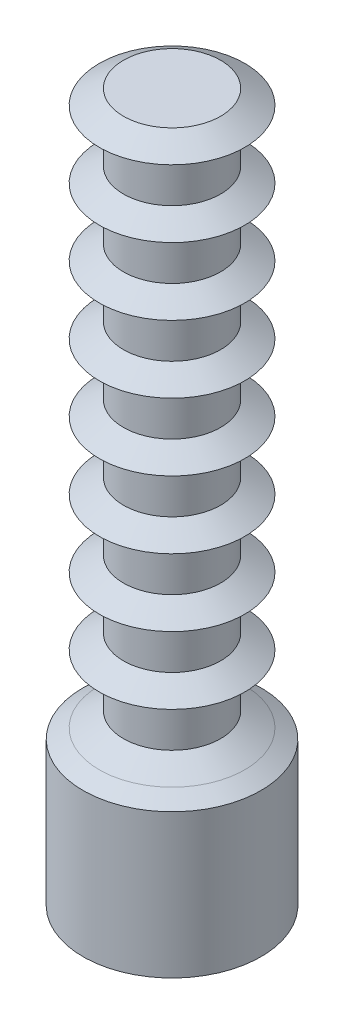
ISO-10303-21;
HEADER;
FILE_DESCRIPTION(('STEP AP214'),'2;1');
FILE_NAME('part.step','',(''),(''),'','','');
FILE_SCHEMA(('AUTOMOTIVE_DESIGN { 1 0 10303 214 1 1 1 1 }'));
ENDSEC;
DATA;
#1=APPLICATION_CONTEXT('core data for automotive mechanical design processes');
#2=APPLICATION_PROTOCOL_DEFINITION('international standard','automotive_design',2000,#1);
#3=PRODUCT_CONTEXT('',#1,'mechanical');
#4=PRODUCT('Part','Part','',(#3));
#5=PRODUCT_RELATED_PRODUCT_CATEGORY('part','',(#4));
#6=PRODUCT_DEFINITION_FORMATION('','',#4);
#7=PRODUCT_DEFINITION_CONTEXT('part definition',#1,'design');
#8=PRODUCT_DEFINITION('design','',#6,#7);
#9=PRODUCT_DEFINITION_SHAPE('','',#8);
#10=(LENGTH_UNIT() NAMED_UNIT(*) SI_UNIT(.MILLI.,.METRE.));
#11=(NAMED_UNIT(*) PLANE_ANGLE_UNIT() SI_UNIT($,.RADIAN.));
#12=(NAMED_UNIT(*) SI_UNIT($,.STERADIAN.) SOLID_ANGLE_UNIT());
#13=UNCERTAINTY_MEASURE_WITH_UNIT(LENGTH_MEASURE(1.E-05),#10,'distance_accuracy_value','');
#14=(GEOMETRIC_REPRESENTATION_CONTEXT(3) GLOBAL_UNCERTAINTY_ASSIGNED_CONTEXT((#13)) GLOBAL_UNIT_ASSIGNED_CONTEXT((#10,
#11,#12)) REPRESENTATION_CONTEXT('',''));
#15=CARTESIAN_POINT('',(0.,0.,0.));
#16=DIRECTION('',(0.,0.,1.));
#17=DIRECTION('',(1.,0.,0.));
#18=AXIS2_PLACEMENT_3D('',#15,#16,#17);
#19=CARTESIAN_POINT('',(-5.43163068128664,7.26000000000113,0.));
#20=DIRECTION('',(0.,-1.,0.));
#21=DIRECTION('',(1.,0.,0.));
#22=AXIS2_PLACEMENT_3D('',#19,#20,#21);
#23=CONICAL_SURFACE('',#22,3.43583917011976,1.02509404757011);
#24=CARTESIAN_POINT('',(-5.43163068128664,6.79599581917504,0.));
#25=DIRECTION('',(0.,1.,0.));
#26=DIRECTION('',(-1.,0.,0.));
#27=AXIS2_PLACEMENT_3D('',#24,#25,#26);
#28=CIRCLE('',#27,4.19999999999962);
#29=CARTESIAN_POINT('',(-9.63163068128626,6.79599581917504,0.));
#30=VERTEX_POINT('',#29);
#31=EDGE_CURVE('E119',#30,#30,#28,.T.);
#32=ORIENTED_EDGE('',*,*,#31,.T.);
#33=EDGE_LOOP('',(#32));
#34=FACE_BOUND('',#33,.T.);
#35=CARTESIAN_POINT('',(-5.43163068128664,7.26000000000113,0.));
#36=DIRECTION('',(0.,1.,0.));
#37=DIRECTION('',(-1.,0.,0.));
#38=AXIS2_PLACEMENT_3D('',#35,#36,#37);
#39=CIRCLE('',#38,3.43583917011976);
#40=CARTESIAN_POINT('',(-8.8674698514064,7.26000000000113,0.));
#41=VERTEX_POINT('',#40);
#42=EDGE_CURVE('E10',#41,#41,#39,.T.);
#43=ORIENTED_EDGE('',*,*,#42,.F.);
#44=EDGE_LOOP('',(#43));
#45=FACE_BOUND('',#44,.T.);
#46=ADVANCED_FACE('F31',(#34,#45),#23,.T.);
#47=CARTESIAN_POINT('',(-5.43163068128664,7.96000000000303,0.));
#48=DIRECTION('',(0.,-1.,0.));
#49=DIRECTION('',(1.,0.,0.));
#50=AXIS2_PLACEMENT_3D('',#47,#48,#49);
#51=CONICAL_SURFACE('',#50,2.29276466619483,1.02132101334252);
#52=ORIENTED_EDGE('',*,*,#42,.T.);
#53=EDGE_LOOP('',(#52));
#54=FACE_BOUND('',#53,.T.);
#55=CARTESIAN_POINT('',(-5.43163068128664,7.96000000000303,0.));
#56=DIRECTION('',(0.,1.,0.));
#57=DIRECTION('',(-1.,0.,0.));
#58=AXIS2_PLACEMENT_3D('',#55,#56,#57);
#59=CIRCLE('',#58,2.29276466619483);
#60=CARTESIAN_POINT('',(-7.72439534748146,7.96000000000303,0.));
#61=VERTEX_POINT('',#60);
#62=EDGE_CURVE('E37',#61,#61,#59,.T.);
#63=ORIENTED_EDGE('',*,*,#62,.F.);
#64=EDGE_LOOP('',(#63));
#65=FACE_BOUND('',#64,.T.);
#66=ADVANCED_FACE('F142',(#54,#65),#51,.T.);
#67=CARTESIAN_POINT('',(-5.43163068128664,34.1999999999976,0.));
#68=DIRECTION('',(0.,1.,0.));
#69=DIRECTION('',(-1.,0.,0.));
#70=AXIS2_PLACEMENT_3D('',#67,#68,#69);
#71=CYLINDRICAL_SURFACE('',#70,2.29276466619476);
#72=CARTESIAN_POINT('',(-5.43163068128664,9.75415529764743,0.));
#73=DIRECTION('',(0.,1.,0.));
#74=DIRECTION('',(-1.,0.,0.));
#75=AXIS2_PLACEMENT_3D('',#72,#73,#74);
#76=CIRCLE('',#75,2.29276466619469);
#77=CARTESIAN_POINT('',(-7.72439534748133,9.75415529764743,0.));
#78=VERTEX_POINT('',#77);
#79=EDGE_CURVE('E41',#78,#78,#76,.T.);
#80=ORIENTED_EDGE('',*,*,#79,.F.);
#81=EDGE_LOOP('',(#80));
#82=FACE_BOUND('',#81,.T.);
#83=ORIENTED_EDGE('',*,*,#62,.T.);
#84=EDGE_LOOP('',(#83));
#85=FACE_BOUND('',#84,.T.);
#86=ADVANCED_FACE('F146',(#82,#85),#71,.T.);
#87=CARTESIAN_POINT('',(-5.43163068128664,9.75415529764743,0.));
#88=DIRECTION('',(0.,1.,0.));
#89=DIRECTION('',(-1.,0.,0.));
#90=AXIS2_PLACEMENT_3D('',#87,#88,#89);
#91=CONICAL_SURFACE('',#90,2.29276466619469,1.03037682652546);
#92=CARTESIAN_POINT('',(-5.43163068128664,10.4400000000007,0.));
#93=DIRECTION('',(0.,1.,0.));
#94=DIRECTION('',(-1.,0.,0.));
#95=AXIS2_PLACEMENT_3D('',#92,#93,#94);
#96=CIRCLE('',#95,3.43583917011973);
#97=CARTESIAN_POINT('',(-8.86746985140636,10.4400000000007,0.));
#98=VERTEX_POINT('',#97);
#99=EDGE_CURVE('E45',#98,#98,#96,.T.);
#100=ORIENTED_EDGE('',*,*,#99,.F.);
#101=EDGE_LOOP('',(#100));
#102=FACE_BOUND('',#101,.T.);
#103=ORIENTED_EDGE('',*,*,#79,.T.);
#104=EDGE_LOOP('',(#103));
#105=FACE_BOUND('',#104,.T.);
#106=ADVANCED_FACE('F150',(#102,#105),#91,.T.);
#107=CARTESIAN_POINT('',(-5.43163068128664,11.1400000000026,0.));
#108=DIRECTION('',(0.,-1.,0.));
#109=DIRECTION('',(1.,0.,0.));
#110=AXIS2_PLACEMENT_3D('',#107,#108,#109);
#111=CONICAL_SURFACE('',#110,2.29276466619479,1.02132101334252);
#112=ORIENTED_EDGE('',*,*,#99,.T.);
#113=EDGE_LOOP('',(#112));
#114=FACE_BOUND('',#113,.T.);
#115=CARTESIAN_POINT('',(-5.43163068128664,11.1400000000026,0.));
#116=DIRECTION('',(0.,1.,0.));
#117=DIRECTION('',(-1.,0.,0.));
#118=AXIS2_PLACEMENT_3D('',#115,#116,#117);
#119=CIRCLE('',#118,2.29276466619479);
#120=CARTESIAN_POINT('',(-7.72439534748143,11.1400000000026,0.));
#121=VERTEX_POINT('',#120);
#122=EDGE_CURVE('E50',#121,#121,#119,.T.);
#123=ORIENTED_EDGE('',*,*,#122,.F.);
#124=EDGE_LOOP('',(#123));
#125=FACE_BOUND('',#124,.T.);
#126=ADVANCED_FACE('F157',(#114,#125),#111,.T.);
#127=CARTESIAN_POINT('',(-5.43163068128664,34.1999999999976,0.));
#128=DIRECTION('',(0.,1.,0.));
#129=DIRECTION('',(-1.,0.,0.));
#130=AXIS2_PLACEMENT_3D('',#127,#128,#129);
#131=CYLINDRICAL_SURFACE('',#130,2.29276466619473);
#132=CARTESIAN_POINT('',(-5.43163068128664,12.934155297647,0.));
#133=DIRECTION('',(0.,1.,0.));
#134=DIRECTION('',(-1.,0.,0.));
#135=AXIS2_PLACEMENT_3D('',#132,#133,#134);
#136=CIRCLE('',#135,2.29276466619466);
#137=CARTESIAN_POINT('',(-7.7243953474813,12.934155297647,0.));
#138=VERTEX_POINT('',#137);
#139=EDGE_CURVE('E53',#138,#138,#136,.T.);
#140=ORIENTED_EDGE('',*,*,#139,.F.);
#141=EDGE_LOOP('',(#140));
#142=FACE_BOUND('',#141,.T.);
#143=ORIENTED_EDGE('',*,*,#122,.T.);
#144=EDGE_LOOP('',(#143));
#145=FACE_BOUND('',#144,.T.);
#146=ADVANCED_FACE('F161',(#142,#145),#131,.T.);
#147=CARTESIAN_POINT('',(-5.43163068128664,12.934155297647,0.));
#148=DIRECTION('',(0.,1.,0.));
#149=DIRECTION('',(-1.,0.,0.));
#150=AXIS2_PLACEMENT_3D('',#147,#148,#149);
#151=CONICAL_SURFACE('',#150,2.29276466619466,1.03037682652546);
#152=CARTESIAN_POINT('',(-5.43163068128664,13.6200000000002,0.));
#153=DIRECTION('',(0.,1.,0.));
#154=DIRECTION('',(-1.,0.,0.));
#155=AXIS2_PLACEMENT_3D('',#152,#153,#154);
#156=CIRCLE('',#155,3.43583917011969);
#157=CARTESIAN_POINT('',(-8.86746985140633,13.6200000000002,0.));
#158=VERTEX_POINT('',#157);
#159=EDGE_CURVE('E56',#158,#158,#156,.T.);
#160=ORIENTED_EDGE('',*,*,#159,.F.);
#161=EDGE_LOOP('',(#160));
#162=FACE_BOUND('',#161,.T.);
#163=ORIENTED_EDGE('',*,*,#139,.T.);
#164=EDGE_LOOP('',(#163));
#165=FACE_BOUND('',#164,.T.);
#166=ADVANCED_FACE('F165',(#162,#165),#151,.T.);
#167=CARTESIAN_POINT('',(-5.43163068128664,14.3200000000021,0.));
#168=DIRECTION('',(0.,-1.,0.));
#169=DIRECTION('',(1.,0.,0.));
#170=AXIS2_PLACEMENT_3D('',#167,#168,#169);
#171=CONICAL_SURFACE('',#170,2.29276466619476,1.02132101334252);
#172=ORIENTED_EDGE('',*,*,#159,.T.);
#173=EDGE_LOOP('',(#172));
#174=FACE_BOUND('',#173,.T.);
#175=CARTESIAN_POINT('',(-5.43163068128664,14.3200000000021,0.));
#176=DIRECTION('',(0.,1.,0.));
#177=DIRECTION('',(-1.,0.,0.));
#178=AXIS2_PLACEMENT_3D('',#175,#176,#177);
#179=CIRCLE('',#178,2.29276466619476);
#180=CARTESIAN_POINT('',(-7.7243953474814,14.3200000000021,0.));
#181=VERTEX_POINT('',#180);
#182=EDGE_CURVE('E59',#181,#181,#179,.T.);
#183=ORIENTED_EDGE('',*,*,#182,.F.);
#184=EDGE_LOOP('',(#183));
#185=FACE_BOUND('',#184,.T.);
#186=ADVANCED_FACE('F169',(#174,#185),#171,.T.);
#187=CARTESIAN_POINT('',(-5.43163068128664,34.1999999999976,0.));
#188=DIRECTION('',(0.,1.,0.));
#189=DIRECTION('',(-1.,0.,0.));
#190=AXIS2_PLACEMENT_3D('',#187,#188,#189);
#191=CYLINDRICAL_SURFACE('',#190,2.29276466619469);
#192=CARTESIAN_POINT('',(-5.43163068128664,16.1141552976465,0.));
#193=DIRECTION('',(0.,1.,0.));
#194=DIRECTION('',(-1.,0.,0.));
#195=AXIS2_PLACEMENT_3D('',#192,#193,#194);
#196=CIRCLE('',#195,2.29276466619463);
#197=CARTESIAN_POINT('',(-7.72439534748126,16.1141552976465,0.));
#198=VERTEX_POINT('',#197);
#199=EDGE_CURVE('E62',#198,#198,#196,.T.);
#200=ORIENTED_EDGE('',*,*,#199,.F.);
#201=EDGE_LOOP('',(#200));
#202=FACE_BOUND('',#201,.T.);
#203=ORIENTED_EDGE('',*,*,#182,.T.);
#204=EDGE_LOOP('',(#203));
#205=FACE_BOUND('',#204,.T.);
#206=ADVANCED_FACE('F173',(#202,#205),#191,.T.);
#207=CARTESIAN_POINT('',(-5.43163068128664,16.1141552976465,0.));
#208=DIRECTION('',(0.,1.,0.));
#209=DIRECTION('',(-1.,0.,0.));
#210=AXIS2_PLACEMENT_3D('',#207,#208,#209);
#211=CONICAL_SURFACE('',#210,2.29276466619463,1.03037682652559);
#212=CARTESIAN_POINT('',(-5.43163068128664,16.7999999999995,0.));
#213=DIRECTION('',(0.,1.,0.));
#214=DIRECTION('',(-1.,0.,0.));
#215=AXIS2_PLACEMENT_3D('',#212,#213,#214);
#216=CIRCLE('',#215,3.43583917011961);
#217=CARTESIAN_POINT('',(-8.86746985140625,16.7999999999995,0.));
#218=VERTEX_POINT('',#217);
#219=EDGE_CURVE('E65',#218,#218,#216,.T.);
#220=ORIENTED_EDGE('',*,*,#219,.F.);
#221=EDGE_LOOP('',(#220));
#222=FACE_BOUND('',#221,.T.);
#223=ORIENTED_EDGE('',*,*,#199,.T.);
#224=EDGE_LOOP('',(#223));
#225=FACE_BOUND('',#224,.T.);
#226=ADVANCED_FACE('F177',(#222,#225),#211,.T.);
#227=CARTESIAN_POINT('',(-5.43163068128664,17.5000000000034,0.));
#228=DIRECTION('',(0.,-1.,0.));
#229=DIRECTION('',(1.,0.,0.));
#230=AXIS2_PLACEMENT_3D('',#227,#228,#229);
#231=CONICAL_SURFACE('',#230,2.29276466619473,1.02132101334124);
#232=ORIENTED_EDGE('',*,*,#219,.T.);
#233=EDGE_LOOP('',(#232));
#234=FACE_BOUND('',#233,.T.);
#235=CARTESIAN_POINT('',(-5.43163068128664,17.5000000000034,0.));
#236=DIRECTION('',(0.,1.,0.));
#237=DIRECTION('',(-1.,0.,0.));
#238=AXIS2_PLACEMENT_3D('',#235,#236,#237);
#239=CIRCLE('',#238,2.29276466619473);
#240=CARTESIAN_POINT('',(-7.72439534748136,17.5000000000034,0.));
#241=VERTEX_POINT('',#240);
#242=EDGE_CURVE('E68',#241,#241,#239,.T.);
#243=ORIENTED_EDGE('',*,*,#242,.F.);
#244=EDGE_LOOP('',(#243));
#245=FACE_BOUND('',#244,.T.);
#246=ADVANCED_FACE('F181',(#234,#245),#231,.T.);
#247=CARTESIAN_POINT('',(-5.43163068128664,34.1999999999976,0.));
#248=DIRECTION('',(0.,1.,0.));
#249=DIRECTION('',(-1.,0.,0.));
#250=AXIS2_PLACEMENT_3D('',#247,#248,#249);
#251=CYLINDRICAL_SURFACE('',#250,2.29276466619461);
#252=CARTESIAN_POINT('',(-5.43163068128664,19.2941552976459,0.));
#253=DIRECTION('',(0.,1.,0.));
#254=DIRECTION('',(-1.,0.,0.));
#255=AXIS2_PLACEMENT_3D('',#252,#253,#254);
#256=CIRCLE('',#255,2.29276466619449);
#257=CARTESIAN_POINT('',(-7.72439534748113,19.2941552976459,0.));
#258=VERTEX_POINT('',#257);
#259=EDGE_CURVE('E71',#258,#258,#256,.T.);
#260=ORIENTED_EDGE('',*,*,#259,.F.);
#261=EDGE_LOOP('',(#260));
#262=FACE_BOUND('',#261,.T.);
#263=ORIENTED_EDGE('',*,*,#242,.T.);
#264=EDGE_LOOP('',(#263));
#265=FACE_BOUND('',#264,.T.);
#266=ADVANCED_FACE('F185',(#262,#265),#251,.T.);
#267=CARTESIAN_POINT('',(-5.43163068128664,19.2941552976459,0.));
#268=DIRECTION('',(0.,1.,0.));
#269=DIRECTION('',(-1.,0.,0.));
#270=AXIS2_PLACEMENT_3D('',#267,#268,#269);
#271=CONICAL_SURFACE('',#270,2.29276466619449,1.03037682652546);
#272=CARTESIAN_POINT('',(-5.43163068128664,19.9799999999991,0.));
#273=DIRECTION('',(0.,1.,0.));
#274=DIRECTION('',(-1.,0.,0.));
#275=AXIS2_PLACEMENT_3D('',#272,#273,#274);
#276=CIRCLE('',#275,3.43583917011953);
#277=CARTESIAN_POINT('',(-8.86746985140616,19.9799999999991,0.));
#278=VERTEX_POINT('',#277);
#279=EDGE_CURVE('E74',#278,#278,#276,.T.);
#280=ORIENTED_EDGE('',*,*,#279,.F.);
#281=EDGE_LOOP('',(#280));
#282=FACE_BOUND('',#281,.T.);
#283=ORIENTED_EDGE('',*,*,#259,.T.);
#284=EDGE_LOOP('',(#283));
#285=FACE_BOUND('',#284,.T.);
#286=ADVANCED_FACE('F189',(#282,#285),#271,.T.);
#287=CARTESIAN_POINT('',(-5.43163068128664,20.6800000000008,0.));
#288=DIRECTION('',(0.,-1.,0.));
#289=DIRECTION('',(1.,0.,0.));
#290=AXIS2_PLACEMENT_3D('',#287,#288,#289);
#291=CONICAL_SURFACE('',#290,2.29276466619469,1.02132101334258);
#292=ORIENTED_EDGE('',*,*,#279,.T.);
#293=EDGE_LOOP('',(#292));
#294=FACE_BOUND('',#293,.T.);
#295=CARTESIAN_POINT('',(-5.43163068128664,20.6800000000008,0.));
#296=DIRECTION('',(0.,1.,0.));
#297=DIRECTION('',(-1.,0.,0.));
#298=AXIS2_PLACEMENT_3D('',#295,#296,#297);
#299=CIRCLE('',#298,2.29276466619469);
#300=CARTESIAN_POINT('',(-7.72439534748133,20.6800000000008,0.));
#301=VERTEX_POINT('',#300);
#302=EDGE_CURVE('E77',#301,#301,#299,.T.);
#303=ORIENTED_EDGE('',*,*,#302,.F.);
#304=EDGE_LOOP('',(#303));
#305=FACE_BOUND('',#304,.T.);
#306=ADVANCED_FACE('F193',(#294,#305),#291,.T.);
#307=CARTESIAN_POINT('',(-5.43163068128664,34.1999999999976,0.));
#308=DIRECTION('',(0.,1.,0.));
#309=DIRECTION('',(-1.,0.,0.));
#310=AXIS2_PLACEMENT_3D('',#307,#308,#309);
#311=CYLINDRICAL_SURFACE('',#310,2.29276466619458);
#312=CARTESIAN_POINT('',(-5.43163068128664,22.4741552976456,0.));
#313=DIRECTION('',(0.,1.,0.));
#314=DIRECTION('',(-1.,0.,0.));
#315=AXIS2_PLACEMENT_3D('',#312,#313,#314);
#316=CIRCLE('',#315,2.29276466619446);
#317=CARTESIAN_POINT('',(-7.7243953474811,22.4741552976456,0.));
#318=VERTEX_POINT('',#317);
#319=EDGE_CURVE('E80',#318,#318,#316,.T.);
#320=ORIENTED_EDGE('',*,*,#319,.F.);
#321=EDGE_LOOP('',(#320));
#322=FACE_BOUND('',#321,.T.);
#323=ORIENTED_EDGE('',*,*,#302,.T.);
#324=EDGE_LOOP('',(#323));
#325=FACE_BOUND('',#324,.T.);
#326=ADVANCED_FACE('F197',(#322,#325),#311,.T.);
#327=CARTESIAN_POINT('',(-5.43163068128664,22.4741552976456,0.));
#328=DIRECTION('',(0.,1.,0.));
#329=DIRECTION('',(-1.,0.,0.));
#330=AXIS2_PLACEMENT_3D('',#327,#328,#329);
#331=CONICAL_SURFACE('',#330,2.29276466619446,1.03037682652546);
#332=CARTESIAN_POINT('',(-5.43163068128664,23.1599999999989,0.));
#333=DIRECTION('',(0.,1.,0.));
#334=DIRECTION('',(-1.,0.,0.));
#335=AXIS2_PLACEMENT_3D('',#332,#333,#334);
#336=CIRCLE('',#335,3.4358391701195);
#337=CARTESIAN_POINT('',(-8.86746985140613,23.1599999999989,0.));
#338=VERTEX_POINT('',#337);
#339=EDGE_CURVE('E83',#338,#338,#336,.T.);
#340=ORIENTED_EDGE('',*,*,#339,.F.);
#341=EDGE_LOOP('',(#340));
#342=FACE_BOUND('',#341,.T.);
#343=ORIENTED_EDGE('',*,*,#319,.T.);
#344=EDGE_LOOP('',(#343));
#345=FACE_BOUND('',#344,.T.);
#346=ADVANCED_FACE('F201',(#342,#345),#331,.T.);
#347=CARTESIAN_POINT('',(-5.43163068128664,23.8600000000017,0.));
#348=DIRECTION('',(0.,-1.,0.));
#349=DIRECTION('',(1.,0.,0.));
#350=AXIS2_PLACEMENT_3D('',#347,#348,#349);
#351=CONICAL_SURFACE('',#350,2.29276466619466,1.02132101334192);
#352=ORIENTED_EDGE('',*,*,#339,.T.);
#353=EDGE_LOOP('',(#352));
#354=FACE_BOUND('',#353,.T.);
#355=CARTESIAN_POINT('',(-5.43163068128664,23.8600000000017,0.));
#356=DIRECTION('',(0.,1.,0.));
#357=DIRECTION('',(-1.,0.,0.));
#358=AXIS2_PLACEMENT_3D('',#355,#356,#357);
#359=CIRCLE('',#358,2.29276466619466);
#360=CARTESIAN_POINT('',(-7.7243953474813,23.8600000000017,0.));
#361=VERTEX_POINT('',#360);
#362=EDGE_CURVE('E86',#361,#361,#359,.T.);
#363=ORIENTED_EDGE('',*,*,#362,.F.);
#364=EDGE_LOOP('',(#363));
#365=FACE_BOUND('',#364,.T.);
#366=ADVANCED_FACE('F205',(#354,#365),#351,.T.);
#367=CARTESIAN_POINT('',(-5.43163068128664,34.1999999999976,0.));
#368=DIRECTION('',(0.,1.,0.));
#369=DIRECTION('',(-1.,0.,0.));
#370=AXIS2_PLACEMENT_3D('',#367,#368,#369);
#371=CYLINDRICAL_SURFACE('',#370,2.29276466619458);
#372=CARTESIAN_POINT('',(-5.43163068128664,25.654155297645,0.));
#373=DIRECTION('',(0.,1.,0.));
#374=DIRECTION('',(-1.,0.,0.));
#375=AXIS2_PLACEMENT_3D('',#372,#373,#374);
#376=CIRCLE('',#375,2.29276466619449);
#377=CARTESIAN_POINT('',(-7.72439534748113,25.654155297645,0.));
#378=VERTEX_POINT('',#377);
#379=EDGE_CURVE('E89',#378,#378,#376,.T.);
#380=ORIENTED_EDGE('',*,*,#379,.F.);
#381=EDGE_LOOP('',(#380));
#382=FACE_BOUND('',#381,.T.);
#383=ORIENTED_EDGE('',*,*,#362,.T.);
#384=EDGE_LOOP('',(#383));
#385=FACE_BOUND('',#384,.T.);
#386=ADVANCED_FACE('F209',(#382,#385),#371,.T.);
#387=CARTESIAN_POINT('',(-5.43163068128664,25.654155297645,0.));
#388=DIRECTION('',(0.,1.,0.));
#389=DIRECTION('',(-1.,0.,0.));
#390=AXIS2_PLACEMENT_3D('',#387,#388,#389);
#391=CONICAL_SURFACE('',#390,2.29276466619449,1.03037682652545);
#392=CARTESIAN_POINT('',(-5.43163068128664,26.3399999999983,0.));
#393=DIRECTION('',(0.,1.,0.));
#394=DIRECTION('',(-1.,0.,0.));
#395=AXIS2_PLACEMENT_3D('',#392,#393,#394);
#396=CIRCLE('',#395,3.43583917011965);
#397=CARTESIAN_POINT('',(-8.86746985140629,26.3399999999983,0.));
#398=VERTEX_POINT('',#397);
#399=EDGE_CURVE('E92',#398,#398,#396,.T.);
#400=ORIENTED_EDGE('',*,*,#399,.F.);
#401=EDGE_LOOP('',(#400));
#402=FACE_BOUND('',#401,.T.);
#403=ORIENTED_EDGE('',*,*,#379,.T.);
#404=EDGE_LOOP('',(#403));
#405=FACE_BOUND('',#404,.T.);
#406=ADVANCED_FACE('F213',(#402,#405),#391,.T.);
#407=CARTESIAN_POINT('',(-5.43163068128664,27.04,0.));
#408=DIRECTION('',(0.,-1.,0.));
#409=DIRECTION('',(1.,0.,0.));
#410=AXIS2_PLACEMENT_3D('',#407,#408,#409);
#411=CONICAL_SURFACE('',#410,2.29276466619456,1.02132101334268);
#412=ORIENTED_EDGE('',*,*,#399,.T.);
#413=EDGE_LOOP('',(#412));
#414=FACE_BOUND('',#413,.T.);
#415=CARTESIAN_POINT('',(-5.43163068128664,27.04,0.));
#416=DIRECTION('',(0.,1.,0.));
#417=DIRECTION('',(-1.,0.,0.));
#418=AXIS2_PLACEMENT_3D('',#415,#416,#417);
#419=CIRCLE('',#418,2.29276466619456);
#420=CARTESIAN_POINT('',(-7.7243953474812,27.04,0.));
#421=VERTEX_POINT('',#420);
#422=EDGE_CURVE('E95',#421,#421,#419,.T.);
#423=ORIENTED_EDGE('',*,*,#422,.F.);
#424=EDGE_LOOP('',(#423));
#425=FACE_BOUND('',#424,.T.);
#426=ADVANCED_FACE('F217',(#414,#425),#411,.T.);
#427=CARTESIAN_POINT('',(-5.43163068128664,34.1999999999976,0.));
#428=DIRECTION('',(0.,1.,0.));
#429=DIRECTION('',(-1.,0.,0.));
#430=AXIS2_PLACEMENT_3D('',#427,#428,#429);
#431=CYLINDRICAL_SURFACE('',#430,2.29276466619453);
#432=CARTESIAN_POINT('',(-5.43163068128664,28.8341552976447,0.));
#433=DIRECTION('',(0.,1.,0.));
#434=DIRECTION('',(-1.,0.,0.));
#435=AXIS2_PLACEMENT_3D('',#432,#433,#434);
#436=CIRCLE('',#435,2.2927646661945);
#437=CARTESIAN_POINT('',(-7.72439534748113,28.8341552976447,0.));
#438=VERTEX_POINT('',#437);
#439=EDGE_CURVE('E98',#438,#438,#436,.T.);
#440=ORIENTED_EDGE('',*,*,#439,.F.);
#441=EDGE_LOOP('',(#440));
#442=FACE_BOUND('',#441,.T.);
#443=ORIENTED_EDGE('',*,*,#422,.T.);
#444=EDGE_LOOP('',(#443));
#445=FACE_BOUND('',#444,.T.);
#446=ADVANCED_FACE('F221',(#442,#445),#431,.T.);
#447=CARTESIAN_POINT('',(-5.43163068128664,28.8341552976447,0.));
#448=DIRECTION('',(0.,1.,0.));
#449=DIRECTION('',(-1.,0.,0.));
#450=AXIS2_PLACEMENT_3D('',#447,#448,#449);
#451=CONICAL_SURFACE('',#450,2.2927646661945,1.03037682652546);
#452=CARTESIAN_POINT('',(-5.43163068128664,29.519999999998,0.));
#453=DIRECTION('',(0.,1.,0.));
#454=DIRECTION('',(-1.,0.,0.));
#455=AXIS2_PLACEMENT_3D('',#452,#453,#454);
#456=CIRCLE('',#455,3.43583917011953);
#457=CARTESIAN_POINT('',(-8.86746985140617,29.519999999998,0.));
#458=VERTEX_POINT('',#457);
#459=EDGE_CURVE('E101',#458,#458,#456,.T.);
#460=ORIENTED_EDGE('',*,*,#459,.F.);
#461=EDGE_LOOP('',(#460));
#462=FACE_BOUND('',#461,.T.);
#463=ORIENTED_EDGE('',*,*,#439,.T.);
#464=EDGE_LOOP('',(#463));
#465=FACE_BOUND('',#464,.T.);
#466=ADVANCED_FACE('F225',(#462,#465),#451,.T.);
#467=CARTESIAN_POINT('',(-5.43163068128664,30.2199999999993,0.));
#468=DIRECTION('',(0.,-1.,0.));
#469=DIRECTION('',(1.,0.,0.));
#470=AXIS2_PLACEMENT_3D('',#467,#468,#469);
#471=CONICAL_SURFACE('',#470,2.2927646661946,1.02132101334286);
#472=ORIENTED_EDGE('',*,*,#459,.T.);
#473=EDGE_LOOP('',(#472));
#474=FACE_BOUND('',#473,.T.);
#475=CARTESIAN_POINT('',(-5.43163068128664,30.2199999999993,0.));
#476=DIRECTION('',(0.,1.,0.));
#477=DIRECTION('',(-1.,0.,0.));
#478=AXIS2_PLACEMENT_3D('',#475,#476,#477);
#479=CIRCLE('',#478,2.2927646661946);
#480=CARTESIAN_POINT('',(-7.72439534748123,30.2199999999993,0.));
#481=VERTEX_POINT('',#480);
#482=EDGE_CURVE('E104',#481,#481,#479,.T.);
#483=ORIENTED_EDGE('',*,*,#482,.F.);
#484=EDGE_LOOP('',(#483));
#485=FACE_BOUND('',#484,.T.);
#486=ADVANCED_FACE('F229',(#474,#485),#471,.T.);
#487=CARTESIAN_POINT('',(-5.43163068128664,34.1999999999976,0.));
#488=DIRECTION('',(0.,1.,0.));
#489=DIRECTION('',(-1.,0.,0.));
#490=AXIS2_PLACEMENT_3D('',#487,#488,#489);
#491=CYLINDRICAL_SURFACE('',#490,2.29276466619453);
#492=CARTESIAN_POINT('',(-5.43163068128664,32.0141552976443,0.));
#493=DIRECTION('',(0.,1.,0.));
#494=DIRECTION('',(-1.,0.,0.));
#495=AXIS2_PLACEMENT_3D('',#492,#493,#494);
#496=CIRCLE('',#495,2.29276466619446);
#497=CARTESIAN_POINT('',(-7.7243953474811,32.0141552976443,0.));
#498=VERTEX_POINT('',#497);
#499=EDGE_CURVE('E107',#498,#498,#496,.T.);
#500=ORIENTED_EDGE('',*,*,#499,.F.);
#501=EDGE_LOOP('',(#500));
#502=FACE_BOUND('',#501,.T.);
#503=ORIENTED_EDGE('',*,*,#482,.T.);
#504=EDGE_LOOP('',(#503));
#505=FACE_BOUND('',#504,.T.);
#506=ADVANCED_FACE('F233',(#502,#505),#491,.T.);
#507=CARTESIAN_POINT('',(-5.43163068128664,32.0141552976443,0.));
#508=DIRECTION('',(0.,1.,0.));
#509=DIRECTION('',(-1.,0.,0.));
#510=AXIS2_PLACEMENT_3D('',#507,#508,#509);
#511=CONICAL_SURFACE('',#510,2.29276466619446,1.03037682652546);
#512=CARTESIAN_POINT('',(-5.43163068128664,32.6999999999975,0.));
#513=DIRECTION('',(0.,1.,0.));
#514=DIRECTION('',(-1.,0.,0.));
#515=AXIS2_PLACEMENT_3D('',#512,#513,#514);
#516=CIRCLE('',#515,3.4358391701195);
#517=CARTESIAN_POINT('',(-8.86746985140614,32.6999999999975,0.));
#518=VERTEX_POINT('',#517);
#519=EDGE_CURVE('E110',#518,#518,#516,.T.);
#520=ORIENTED_EDGE('',*,*,#519,.F.);
#521=EDGE_LOOP('',(#520));
#522=FACE_BOUND('',#521,.T.);
#523=ORIENTED_EDGE('',*,*,#499,.T.);
#524=EDGE_LOOP('',(#523));
#525=FACE_BOUND('',#524,.T.);
#526=ADVANCED_FACE('F237',(#522,#525),#511,.T.);
#527=CARTESIAN_POINT('',(-5.43163068128664,33.3999999999975,0.));
#528=DIRECTION('',(0.,-1.,0.));
#529=DIRECTION('',(1.,0.,0.));
#530=AXIS2_PLACEMENT_3D('',#527,#528,#529);
#531=CONICAL_SURFACE('',#530,2.29276466619388,1.02132101334403);
#532=ORIENTED_EDGE('',*,*,#519,.T.);
#533=EDGE_LOOP('',(#532));
#534=FACE_BOUND('',#533,.T.);
#535=CARTESIAN_POINT('',(-5.43163068128664,33.3999999999975,0.));
#536=DIRECTION('',(0.,1.,0.));
#537=DIRECTION('',(-1.,0.,0.));
#538=AXIS2_PLACEMENT_3D('',#535,#536,#537);
#539=CIRCLE('',#538,2.29276466619388);
#540=CARTESIAN_POINT('',(-7.72439534748051,33.3999999999975,0.));
#541=VERTEX_POINT('',#540);
#542=EDGE_CURVE('E113',#541,#541,#539,.T.);
#543=ORIENTED_EDGE('',*,*,#542,.F.);
#544=EDGE_LOOP('',(#543));
#545=FACE_BOUND('',#544,.T.);
#546=ADVANCED_FACE('F138',(#534,#545),#531,.T.);
#547=CARTESIAN_POINT('',(2.52706982761576E-12,33.3999999999976,0.));
#548=DIRECTION('',(0.,1.,0.));
#549=DIRECTION('',(-1.,0.,0.));
#550=AXIS2_PLACEMENT_3D('',#547,#548,#549);
#551=PLANE('',#550);
#552=ORIENTED_EDGE('',*,*,#542,.T.);
#553=EDGE_LOOP('',(#552));
#554=FACE_BOUND('',#553,.T.);
#555=ADVANCED_FACE('F133',(#554),#551,.T.);
#556=CARTESIAN_POINT('',(0.,-4.95188085387785E-12,0.));
#557=DIRECTION('',(0.,-1.,0.));
#558=DIRECTION('',(1.,0.,0.));
#559=AXIS2_PLACEMENT_3D('',#556,#557,#558);
#560=PLANE('',#559);
#561=CARTESIAN_POINT('',(-5.43163068128663,-4.95437024738976E-12,0.));
#562=DIRECTION('',(0.,1.,0.));
#563=DIRECTION('',(-1.,0.,0.));
#564=AXIS2_PLACEMENT_3D('',#561,#562,#563);
#565=CIRCLE('',#564,4.19999999999962);
#566=CARTESIAN_POINT('',(-9.63163068128626,-4.95490283793063E-12,0.));
#567=VERTEX_POINT('',#566);
#568=EDGE_CURVE('E116',#567,#567,#565,.T.);
#569=ORIENTED_EDGE('',*,*,#568,.F.);
#570=EDGE_LOOP('',(#569));
#571=FACE_BOUND('',#570,.T.);
#572=ADVANCED_FACE('F128',(#571),#560,.T.);
#573=CARTESIAN_POINT('',(-5.43163068128664,34.1999999999976,0.));
#574=DIRECTION('',(0.,1.,0.));
#575=DIRECTION('',(-1.,0.,0.));
#576=AXIS2_PLACEMENT_3D('',#573,#574,#575);
#577=CYLINDRICAL_SURFACE('',#576,4.19999999999962);
#578=ORIENTED_EDGE('',*,*,#31,.F.);
#579=EDGE_LOOP('',(#578));
#580=FACE_BOUND('',#579,.T.);
#581=ORIENTED_EDGE('',*,*,#568,.T.);
#582=EDGE_LOOP('',(#581));
#583=FACE_BOUND('',#582,.T.);
#584=ADVANCED_FACE('F125',(#580,#583),#577,.T.);
#585=CLOSED_SHELL('',(#46,#66,#86,#106,#126,#146,#166,#186,#206,#226,#246,#266,#286,#306,#326,
#346,#366,#386,#406,#426,#446,#466,#486,#506,#526,#546,#555,#572,#584));
#586=MANIFOLD_SOLID_BREP('B2',#585);
#587=ADVANCED_BREP_SHAPE_REPRESENTATION('',(#18,#586),#14);
#588=SHAPE_DEFINITION_REPRESENTATION(#9,#587);
ENDSEC;
END-ISO-10303-21;
